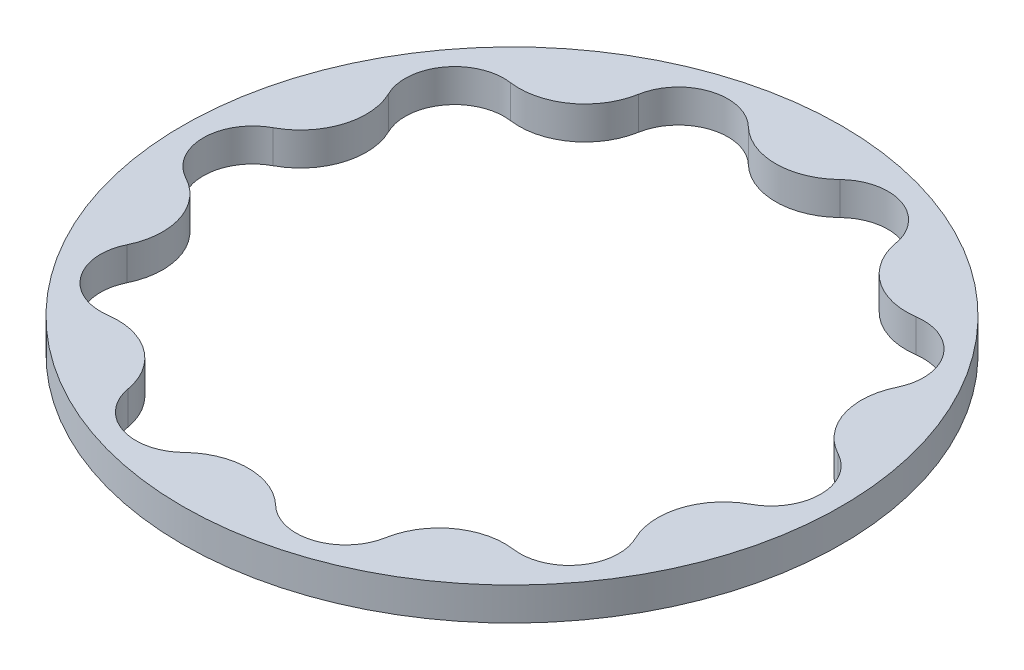
ISO-10303-21;
HEADER;
FILE_DESCRIPTION(('STEP AP214'),'2;1');
FILE_NAME('part.step','',(''),(''),'','','');
FILE_SCHEMA(('AUTOMOTIVE_DESIGN { 1 0 10303 214 1 1 1 1 }'));
ENDSEC;
DATA;
#1=APPLICATION_CONTEXT('core data for automotive mechanical design processes');
#2=APPLICATION_PROTOCOL_DEFINITION('international standard','automotive_design',2000,#1);
#3=PRODUCT_CONTEXT('',#1,'mechanical');
#4=PRODUCT('Part','Part','',(#3));
#5=PRODUCT_RELATED_PRODUCT_CATEGORY('part','',(#4));
#6=PRODUCT_DEFINITION_FORMATION('','',#4);
#7=PRODUCT_DEFINITION_CONTEXT('part definition',#1,'design');
#8=PRODUCT_DEFINITION('design','',#6,#7);
#9=PRODUCT_DEFINITION_SHAPE('','',#8);
#10=(LENGTH_UNIT() NAMED_UNIT(*) SI_UNIT(.MILLI.,.METRE.));
#11=(NAMED_UNIT(*) PLANE_ANGLE_UNIT() SI_UNIT($,.RADIAN.));
#12=(NAMED_UNIT(*) SI_UNIT($,.STERADIAN.) SOLID_ANGLE_UNIT());
#13=UNCERTAINTY_MEASURE_WITH_UNIT(LENGTH_MEASURE(1.E-05),#10,'distance_accuracy_value','');
#14=(GEOMETRIC_REPRESENTATION_CONTEXT(3) GLOBAL_UNCERTAINTY_ASSIGNED_CONTEXT((#13)) GLOBAL_UNIT_ASSIGNED_CONTEXT((#10,
#11,#12)) REPRESENTATION_CONTEXT('',''));
#15=CARTESIAN_POINT('',(0.,0.,0.));
#16=DIRECTION('',(0.,0.,1.));
#17=DIRECTION('',(1.,0.,0.));
#18=AXIS2_PLACEMENT_3D('',#15,#16,#17);
#19=CARTESIAN_POINT('',(0.,10.,0.));
#20=DIRECTION('',(0.,1.,0.));
#21=DIRECTION('',(0.,0.,1.));
#22=AXIS2_PLACEMENT_3D('',#19,#20,#21);
#23=PLANE('',#22);
#24=CARTESIAN_POINT('',(0.,10.,0.));
#25=DIRECTION('',(0.,1.,0.));
#26=DIRECTION('',(0.,0.,1.));
#27=AXIS2_PLACEMENT_3D('',#24,#25,#26);
#28=CIRCLE('',#27,100.);
#29=CARTESIAN_POINT('',(0.,10.,100.));
#30=VERTEX_POINT('',#29);
#31=EDGE_CURVE('E11',#30,#30,#28,.T.);
#32=ORIENTED_EDGE('',*,*,#31,.T.);
#33=EDGE_LOOP('',(#32));
#34=FACE_BOUND('',#33,.T.);
#35=CARTESIAN_POINT('',(0.,10.,-100.));
#36=DIRECTION('',(0.,-1.,0.));
#37=DIRECTION('',(0.,0.,1.));
#38=AXIS2_PLACEMENT_3D('',#35,#36,#37);
#39=CIRCLE('',#38,20.);
#40=CARTESIAN_POINT('',(13.8918836144796,10.,-85.6119643577814));
#41=VERTEX_POINT('',#40);
#42=CARTESIAN_POINT('',(-13.8918836144796,10.,-85.6119643577814));
#43=VERTEX_POINT('',#42);
#44=EDGE_CURVE('E179',#41,#43,#39,.T.);
#45=ORIENTED_EDGE('',*,*,#44,.F.);
#46=CARTESIAN_POINT('',(24.3107963253393,10.,-74.8209376261174));
#47=DIRECTION('',(0.,1.,0.));
#48=DIRECTION('',(0.,0.,-1.));
#49=AXIS2_PLACEMENT_3D('',#46,#47,#48);
#50=CIRCLE('',#49,15.);
#51=CARTESIAN_POINT('',(39.0826801412999,10.,-77.426978402422));
#52=VERTEX_POINT('',#51);
#53=EDGE_CURVE('E171',#52,#41,#50,.T.);
#54=ORIENTED_EDGE('',*,*,#53,.F.);
#55=CARTESIAN_POINT('',(58.7785252292473,10.,-80.9016994374948));
#56=DIRECTION('',(0.,-1.,0.));
#57=DIRECTION('',(0.,0.,1.));
#58=AXIS2_PLACEMENT_3D('',#55,#56,#57);
#59=CIRCLE('',#58,20.);
#60=CARTESIAN_POINT('',(61.5602199972856,10.,-61.0960897721129));
#61=VERTEX_POINT('',#60);
#62=EDGE_CURVE('E227',#61,#52,#59,.T.);
#63=ORIENTED_EDGE('',*,*,#62,.F.);
#64=CARTESIAN_POINT('',(63.6464910733144,10.,-46.2418825230764));
#65=DIRECTION('',(0.,1.,0.));
#66=DIRECTION('',(0.,0.,-1.));
#67=AXIS2_PLACEMENT_3D('',#64,#65,#66);
#68=CIRCLE('',#67,15.);
#69=CARTESIAN_POINT('',(77.1289884545434,10.,-39.6675183435414));
#70=VERTEX_POINT('',#69);
#71=EDGE_CURVE('E225',#70,#61,#68,.T.);
#72=ORIENTED_EDGE('',*,*,#71,.F.);
#73=CARTESIAN_POINT('',(95.1056516295154,10.,-30.9016994374948));
#74=DIRECTION('',(0.,-1.,0.));
#75=DIRECTION('',(0.,0.,1.));
#76=AXIS2_PLACEMENT_3D('',#73,#74,#75);
#77=CIRCLE('',#76,20.);
#78=CARTESIAN_POINT('',(85.7146446960495,10.,-13.243585473212));
#79=VERTEX_POINT('',#78);
#80=EDGE_CURVE('E223',#79,#70,#77,.T.);
#81=ORIENTED_EDGE('',*,*,#80,.F.);
#82=CARTESIAN_POINT('',(78.6713894959501,10.,0.));
#83=DIRECTION('',(0.,1.,0.));
#84=DIRECTION('',(0.,0.,-1.));
#85=AXIS2_PLACEMENT_3D('',#82,#83,#84);
#86=CIRCLE('',#85,15.);
#87=CARTESIAN_POINT('',(85.7146446960495,10.,13.243585473212));
#88=VERTEX_POINT('',#87);
#89=EDGE_CURVE('E221',#88,#79,#86,.T.);
#90=ORIENTED_EDGE('',*,*,#89,.F.);
#91=CARTESIAN_POINT('',(95.1056516295154,10.,30.9016994374947));
#92=DIRECTION('',(0.,-1.,0.));
#93=DIRECTION('',(0.,0.,1.));
#94=AXIS2_PLACEMENT_3D('',#91,#92,#93);
#95=CIRCLE('',#94,20.);
#96=CARTESIAN_POINT('',(77.1289884545434,10.,39.6675183435415));
#97=VERTEX_POINT('',#96);
#98=EDGE_CURVE('E219',#97,#88,#95,.T.);
#99=ORIENTED_EDGE('',*,*,#98,.F.);
#100=CARTESIAN_POINT('',(63.6464910733144,10.,46.2418825230765));
#101=DIRECTION('',(0.,1.,0.));
#102=DIRECTION('',(0.,0.,-1.));
#103=AXIS2_PLACEMENT_3D('',#100,#101,#102);
#104=CIRCLE('',#103,15.);
#105=CARTESIAN_POINT('',(61.5602199972856,10.,61.0960897721129));
#106=VERTEX_POINT('',#105);
#107=EDGE_CURVE('E217',#106,#97,#104,.T.);
#108=ORIENTED_EDGE('',*,*,#107,.F.);
#109=CARTESIAN_POINT('',(58.7785252292473,10.,80.9016994374947));
#110=DIRECTION('',(0.,-1.,0.));
#111=DIRECTION('',(0.,0.,1.));
#112=AXIS2_PLACEMENT_3D('',#109,#110,#111);
#113=CIRCLE('',#112,20.);
#114=CARTESIAN_POINT('',(39.0826801412999,10.,77.4269784024221));
#115=VERTEX_POINT('',#114);
#116=EDGE_CURVE('E215',#115,#106,#113,.T.);
#117=ORIENTED_EDGE('',*,*,#116,.F.);
#118=CARTESIAN_POINT('',(24.3107963253393,10.,74.8209376261175));
#119=DIRECTION('',(0.,1.,0.));
#120=DIRECTION('',(0.,0.,-1.));
#121=AXIS2_PLACEMENT_3D('',#118,#119,#120);
#122=CIRCLE('',#121,15.);
#123=CARTESIAN_POINT('',(13.8918836144796,10.,85.6119643577815));
#124=VERTEX_POINT('',#123);
#125=EDGE_CURVE('E213',#124,#115,#122,.T.);
#126=ORIENTED_EDGE('',*,*,#125,.F.);
#127=CARTESIAN_POINT('',(0.,10.,100.));
#128=DIRECTION('',(0.,-1.,0.));
#129=DIRECTION('',(0.,0.,1.));
#130=AXIS2_PLACEMENT_3D('',#127,#128,#129);
#131=CIRCLE('',#130,20.);
#132=CARTESIAN_POINT('',(-13.8918836144796,10.,85.6119643577815));
#133=VERTEX_POINT('',#132);
#134=EDGE_CURVE('E211',#133,#124,#131,.T.);
#135=ORIENTED_EDGE('',*,*,#134,.F.);
#136=CARTESIAN_POINT('',(-24.3107963253393,10.,74.8209376261175));
#137=DIRECTION('',(0.,1.,0.));
#138=DIRECTION('',(0.,0.,-1.));
#139=AXIS2_PLACEMENT_3D('',#136,#137,#138);
#140=CIRCLE('',#139,15.);
#141=CARTESIAN_POINT('',(-39.0826801412999,10.,77.4269784024221));
#142=VERTEX_POINT('',#141);
#143=EDGE_CURVE('E209',#142,#133,#140,.T.);
#144=ORIENTED_EDGE('',*,*,#143,.F.);
#145=CARTESIAN_POINT('',(-58.7785252292473,10.,80.9016994374947));
#146=DIRECTION('',(0.,-1.,0.));
#147=DIRECTION('',(0.,0.,1.));
#148=AXIS2_PLACEMENT_3D('',#145,#146,#147);
#149=CIRCLE('',#148,20.);
#150=CARTESIAN_POINT('',(-61.5602199972857,10.,61.0960897721129));
#151=VERTEX_POINT('',#150);
#152=EDGE_CURVE('E207',#151,#142,#149,.T.);
#153=ORIENTED_EDGE('',*,*,#152,.F.);
#154=CARTESIAN_POINT('',(-63.6464910733144,10.,46.2418825230765));
#155=DIRECTION('',(0.,1.,0.));
#156=DIRECTION('',(0.,0.,-1.));
#157=AXIS2_PLACEMENT_3D('',#154,#155,#156);
#158=CIRCLE('',#157,15.);
#159=CARTESIAN_POINT('',(-77.1289884545434,10.,39.6675183435415));
#160=VERTEX_POINT('',#159);
#161=EDGE_CURVE('E205',#160,#151,#158,.T.);
#162=ORIENTED_EDGE('',*,*,#161,.F.);
#163=CARTESIAN_POINT('',(-95.1056516295154,10.,30.9016994374947));
#164=DIRECTION('',(0.,-1.,0.));
#165=DIRECTION('',(0.,0.,1.));
#166=AXIS2_PLACEMENT_3D('',#163,#164,#165);
#167=CIRCLE('',#166,20.);
#168=CARTESIAN_POINT('',(-85.7146446960495,10.,13.2435854732121));
#169=VERTEX_POINT('',#168);
#170=EDGE_CURVE('E203',#169,#160,#167,.T.);
#171=ORIENTED_EDGE('',*,*,#170,.F.);
#172=CARTESIAN_POINT('',(-78.6713894959501,10.,0.));
#173=DIRECTION('',(0.,1.,0.));
#174=DIRECTION('',(0.,0.,-1.));
#175=AXIS2_PLACEMENT_3D('',#172,#173,#174);
#176=CIRCLE('',#175,15.);
#177=CARTESIAN_POINT('',(-85.7146446960496,10.,-13.243585473212));
#178=VERTEX_POINT('',#177);
#179=EDGE_CURVE('E201',#178,#169,#176,.T.);
#180=ORIENTED_EDGE('',*,*,#179,.F.);
#181=CARTESIAN_POINT('',(-95.1056516295154,10.,-30.9016994374947));
#182=DIRECTION('',(0.,-1.,0.));
#183=DIRECTION('',(0.,0.,1.));
#184=AXIS2_PLACEMENT_3D('',#181,#182,#183);
#185=CIRCLE('',#184,20.);
#186=CARTESIAN_POINT('',(-77.1289884545434,10.,-39.6675183435414));
#187=VERTEX_POINT('',#186);
#188=EDGE_CURVE('E199',#187,#178,#185,.T.);
#189=ORIENTED_EDGE('',*,*,#188,.F.);
#190=CARTESIAN_POINT('',(-63.6464910733144,10.,-46.2418825230764));
#191=DIRECTION('',(0.,1.,0.));
#192=DIRECTION('',(0.,0.,-1.));
#193=AXIS2_PLACEMENT_3D('',#190,#191,#192);
#194=CIRCLE('',#193,15.);
#195=CARTESIAN_POINT('',(-61.5602199972857,10.,-61.0960897721129));
#196=VERTEX_POINT('',#195);
#197=EDGE_CURVE('E197',#196,#187,#194,.T.);
#198=ORIENTED_EDGE('',*,*,#197,.F.);
#199=CARTESIAN_POINT('',(-58.7785252292473,10.,-80.9016994374947));
#200=DIRECTION('',(0.,-1.,0.));
#201=DIRECTION('',(0.,0.,1.));
#202=AXIS2_PLACEMENT_3D('',#199,#200,#201);
#203=CIRCLE('',#202,20.);
#204=CARTESIAN_POINT('',(-39.0826801412999,10.,-77.426978402422));
#205=VERTEX_POINT('',#204);
#206=EDGE_CURVE('E193',#205,#196,#203,.T.);
#207=ORIENTED_EDGE('',*,*,#206,.F.);
#208=CARTESIAN_POINT('',(-24.3107963253393,10.,-74.8209376261174));
#209=DIRECTION('',(0.,1.,0.));
#210=DIRECTION('',(0.,0.,-1.));
#211=AXIS2_PLACEMENT_3D('',#208,#209,#210);
#212=CIRCLE('',#211,15.);
#213=EDGE_CURVE('E191',#43,#205,#212,.T.);
#214=ORIENTED_EDGE('',*,*,#213,.F.);
#215=EDGE_LOOP('',(#45,#54,#63,#72,#81,#90,#99,#108,#117,#126,#135,#144,#153,#162,#171,#180,
#189,#198,#207,#214));
#216=FACE_BOUND('',#215,.T.);
#217=ADVANCED_FACE('F34',(#34,#216),#23,.T.);
#218=CARTESIAN_POINT('',(0.,0.,0.));
#219=DIRECTION('',(0.,1.,0.));
#220=DIRECTION('',(0.,0.,1.));
#221=AXIS2_PLACEMENT_3D('',#218,#219,#220);
#222=PLANE('',#221);
#223=CARTESIAN_POINT('',(0.,0.,0.));
#224=DIRECTION('',(0.,1.,0.));
#225=DIRECTION('',(0.,0.,1.));
#226=AXIS2_PLACEMENT_3D('',#223,#224,#225);
#227=CIRCLE('',#226,100.);
#228=CARTESIAN_POINT('',(0.,0.,100.));
#229=VERTEX_POINT('',#228);
#230=EDGE_CURVE('E38',#229,#229,#227,.T.);
#231=ORIENTED_EDGE('',*,*,#230,.F.);
#232=EDGE_LOOP('',(#231));
#233=FACE_BOUND('',#232,.T.);
#234=CARTESIAN_POINT('',(24.3107963253393,0.,-74.8209376261174));
#235=DIRECTION('',(0.,1.,0.));
#236=DIRECTION('',(0.,0.,-1.));
#237=AXIS2_PLACEMENT_3D('',#234,#235,#236);
#238=CIRCLE('',#237,15.);
#239=CARTESIAN_POINT('',(39.0826801412999,0.,-77.426978402422));
#240=VERTEX_POINT('',#239);
#241=CARTESIAN_POINT('',(13.8918836144796,0.,-85.6119643577814));
#242=VERTEX_POINT('',#241);
#243=EDGE_CURVE('E57',#240,#242,#238,.T.);
#244=ORIENTED_EDGE('',*,*,#243,.T.);
#245=CARTESIAN_POINT('',(0.,0.,-100.));
#246=DIRECTION('',(0.,-1.,0.));
#247=DIRECTION('',(0.,0.,1.));
#248=AXIS2_PLACEMENT_3D('',#245,#246,#247);
#249=CIRCLE('',#248,20.);
#250=CARTESIAN_POINT('',(-13.8918836144796,0.,-85.6119643577814));
#251=VERTEX_POINT('',#250);
#252=EDGE_CURVE('E186',#242,#251,#249,.T.);
#253=ORIENTED_EDGE('',*,*,#252,.T.);
#254=CARTESIAN_POINT('',(-24.3107963253393,0.,-74.8209376261174));
#255=DIRECTION('',(0.,1.,0.));
#256=DIRECTION('',(0.,0.,-1.));
#257=AXIS2_PLACEMENT_3D('',#254,#255,#256);
#258=CIRCLE('',#257,15.);
#259=CARTESIAN_POINT('',(-39.0826801412999,0.,-77.426978402422));
#260=VERTEX_POINT('',#259);
#261=EDGE_CURVE('E231',#251,#260,#258,.T.);
#262=ORIENTED_EDGE('',*,*,#261,.T.);
#263=CARTESIAN_POINT('',(-58.7785252292473,0.,-80.9016994374947));
#264=DIRECTION('',(0.,-1.,0.));
#265=DIRECTION('',(0.,0.,1.));
#266=AXIS2_PLACEMENT_3D('',#263,#264,#265);
#267=CIRCLE('',#266,20.);
#268=CARTESIAN_POINT('',(-61.5602199972857,0.,-61.0960897721129));
#269=VERTEX_POINT('',#268);
#270=EDGE_CURVE('E234',#260,#269,#267,.T.);
#271=ORIENTED_EDGE('',*,*,#270,.T.);
#272=CARTESIAN_POINT('',(-63.6464910733144,0.,-46.2418825230764));
#273=DIRECTION('',(0.,1.,0.));
#274=DIRECTION('',(0.,0.,-1.));
#275=AXIS2_PLACEMENT_3D('',#272,#273,#274);
#276=CIRCLE('',#275,15.);
#277=CARTESIAN_POINT('',(-77.1289884545434,0.,-39.6675183435414));
#278=VERTEX_POINT('',#277);
#279=EDGE_CURVE('E237',#269,#278,#276,.T.);
#280=ORIENTED_EDGE('',*,*,#279,.T.);
#281=CARTESIAN_POINT('',(-95.1056516295154,0.,-30.9016994374947));
#282=DIRECTION('',(0.,-1.,0.));
#283=DIRECTION('',(0.,0.,1.));
#284=AXIS2_PLACEMENT_3D('',#281,#282,#283);
#285=CIRCLE('',#284,20.);
#286=CARTESIAN_POINT('',(-85.7146446960496,0.,-13.243585473212));
#287=VERTEX_POINT('',#286);
#288=EDGE_CURVE('E240',#278,#287,#285,.T.);
#289=ORIENTED_EDGE('',*,*,#288,.T.);
#290=CARTESIAN_POINT('',(-78.6713894959501,0.,0.));
#291=DIRECTION('',(0.,1.,0.));
#292=DIRECTION('',(0.,0.,-1.));
#293=AXIS2_PLACEMENT_3D('',#290,#291,#292);
#294=CIRCLE('',#293,15.);
#295=CARTESIAN_POINT('',(-85.7146446960495,0.,13.2435854732121));
#296=VERTEX_POINT('',#295);
#297=EDGE_CURVE('E243',#287,#296,#294,.T.);
#298=ORIENTED_EDGE('',*,*,#297,.T.);
#299=CARTESIAN_POINT('',(-95.1056516295154,0.,30.9016994374947));
#300=DIRECTION('',(0.,-1.,0.));
#301=DIRECTION('',(0.,0.,1.));
#302=AXIS2_PLACEMENT_3D('',#299,#300,#301);
#303=CIRCLE('',#302,20.);
#304=CARTESIAN_POINT('',(-77.1289884545434,0.,39.6675183435415));
#305=VERTEX_POINT('',#304);
#306=EDGE_CURVE('E246',#296,#305,#303,.T.);
#307=ORIENTED_EDGE('',*,*,#306,.T.);
#308=CARTESIAN_POINT('',(-63.6464910733144,0.,46.2418825230765));
#309=DIRECTION('',(0.,1.,0.));
#310=DIRECTION('',(0.,0.,-1.));
#311=AXIS2_PLACEMENT_3D('',#308,#309,#310);
#312=CIRCLE('',#311,15.);
#313=CARTESIAN_POINT('',(-61.5602199972857,0.,61.0960897721129));
#314=VERTEX_POINT('',#313);
#315=EDGE_CURVE('E249',#305,#314,#312,.T.);
#316=ORIENTED_EDGE('',*,*,#315,.T.);
#317=CARTESIAN_POINT('',(-58.7785252292473,0.,80.9016994374947));
#318=DIRECTION('',(0.,-1.,0.));
#319=DIRECTION('',(0.,0.,1.));
#320=AXIS2_PLACEMENT_3D('',#317,#318,#319);
#321=CIRCLE('',#320,20.);
#322=CARTESIAN_POINT('',(-39.0826801412999,0.,77.4269784024221));
#323=VERTEX_POINT('',#322);
#324=EDGE_CURVE('E252',#314,#323,#321,.T.);
#325=ORIENTED_EDGE('',*,*,#324,.T.);
#326=CARTESIAN_POINT('',(-24.3107963253393,0.,74.8209376261175));
#327=DIRECTION('',(0.,1.,0.));
#328=DIRECTION('',(0.,0.,-1.));
#329=AXIS2_PLACEMENT_3D('',#326,#327,#328);
#330=CIRCLE('',#329,15.);
#331=CARTESIAN_POINT('',(-13.8918836144796,0.,85.6119643577815));
#332=VERTEX_POINT('',#331);
#333=EDGE_CURVE('E255',#323,#332,#330,.T.);
#334=ORIENTED_EDGE('',*,*,#333,.T.);
#335=CARTESIAN_POINT('',(0.,0.,100.));
#336=DIRECTION('',(0.,-1.,0.));
#337=DIRECTION('',(0.,0.,1.));
#338=AXIS2_PLACEMENT_3D('',#335,#336,#337);
#339=CIRCLE('',#338,20.);
#340=CARTESIAN_POINT('',(13.8918836144796,0.,85.6119643577815));
#341=VERTEX_POINT('',#340);
#342=EDGE_CURVE('E258',#332,#341,#339,.T.);
#343=ORIENTED_EDGE('',*,*,#342,.T.);
#344=CARTESIAN_POINT('',(24.3107963253393,0.,74.8209376261175));
#345=DIRECTION('',(0.,1.,0.));
#346=DIRECTION('',(0.,0.,-1.));
#347=AXIS2_PLACEMENT_3D('',#344,#345,#346);
#348=CIRCLE('',#347,15.);
#349=CARTESIAN_POINT('',(39.0826801412999,0.,77.4269784024221));
#350=VERTEX_POINT('',#349);
#351=EDGE_CURVE('E261',#341,#350,#348,.T.);
#352=ORIENTED_EDGE('',*,*,#351,.T.);
#353=CARTESIAN_POINT('',(58.7785252292473,0.,80.9016994374947));
#354=DIRECTION('',(0.,-1.,0.));
#355=DIRECTION('',(0.,0.,1.));
#356=AXIS2_PLACEMENT_3D('',#353,#354,#355);
#357=CIRCLE('',#356,20.);
#358=CARTESIAN_POINT('',(61.5602199972856,0.,61.0960897721129));
#359=VERTEX_POINT('',#358);
#360=EDGE_CURVE('E264',#350,#359,#357,.T.);
#361=ORIENTED_EDGE('',*,*,#360,.T.);
#362=CARTESIAN_POINT('',(63.6464910733144,0.,46.2418825230765));
#363=DIRECTION('',(0.,1.,0.));
#364=DIRECTION('',(0.,0.,-1.));
#365=AXIS2_PLACEMENT_3D('',#362,#363,#364);
#366=CIRCLE('',#365,15.);
#367=CARTESIAN_POINT('',(77.1289884545434,0.,39.6675183435415));
#368=VERTEX_POINT('',#367);
#369=EDGE_CURVE('E267',#359,#368,#366,.T.);
#370=ORIENTED_EDGE('',*,*,#369,.T.);
#371=CARTESIAN_POINT('',(95.1056516295154,0.,30.9016994374947));
#372=DIRECTION('',(0.,-1.,0.));
#373=DIRECTION('',(0.,0.,1.));
#374=AXIS2_PLACEMENT_3D('',#371,#372,#373);
#375=CIRCLE('',#374,20.);
#376=CARTESIAN_POINT('',(85.7146446960495,0.,13.243585473212));
#377=VERTEX_POINT('',#376);
#378=EDGE_CURVE('E270',#368,#377,#375,.T.);
#379=ORIENTED_EDGE('',*,*,#378,.T.);
#380=CARTESIAN_POINT('',(78.6713894959501,0.,0.));
#381=DIRECTION('',(0.,1.,0.));
#382=DIRECTION('',(0.,0.,-1.));
#383=AXIS2_PLACEMENT_3D('',#380,#381,#382);
#384=CIRCLE('',#383,15.);
#385=CARTESIAN_POINT('',(85.7146446960495,0.,-13.243585473212));
#386=VERTEX_POINT('',#385);
#387=EDGE_CURVE('E273',#377,#386,#384,.T.);
#388=ORIENTED_EDGE('',*,*,#387,.T.);
#389=CARTESIAN_POINT('',(95.1056516295154,0.,-30.9016994374948));
#390=DIRECTION('',(0.,-1.,0.));
#391=DIRECTION('',(0.,0.,1.));
#392=AXIS2_PLACEMENT_3D('',#389,#390,#391);
#393=CIRCLE('',#392,20.);
#394=CARTESIAN_POINT('',(77.1289884545434,0.,-39.6675183435414));
#395=VERTEX_POINT('',#394);
#396=EDGE_CURVE('E276',#386,#395,#393,.T.);
#397=ORIENTED_EDGE('',*,*,#396,.T.);
#398=CARTESIAN_POINT('',(63.6464910733144,0.,-46.2418825230764));
#399=DIRECTION('',(0.,1.,0.));
#400=DIRECTION('',(0.,0.,-1.));
#401=AXIS2_PLACEMENT_3D('',#398,#399,#400);
#402=CIRCLE('',#401,15.);
#403=CARTESIAN_POINT('',(61.5602199972856,0.,-61.0960897721129));
#404=VERTEX_POINT('',#403);
#405=EDGE_CURVE('E279',#395,#404,#402,.T.);
#406=ORIENTED_EDGE('',*,*,#405,.T.);
#407=CARTESIAN_POINT('',(58.7785252292473,0.,-80.9016994374948));
#408=DIRECTION('',(0.,-1.,0.));
#409=DIRECTION('',(0.,0.,1.));
#410=AXIS2_PLACEMENT_3D('',#407,#408,#409);
#411=CIRCLE('',#410,20.);
#412=EDGE_CURVE('E180',#404,#240,#411,.T.);
#413=ORIENTED_EDGE('',*,*,#412,.T.);
#414=EDGE_LOOP('',(#244,#253,#262,#271,#280,#289,#298,#307,#316,#325,#334,#343,#352,#361,#370,
#379,#388,#397,#406,#413));
#415=FACE_BOUND('',#414,.T.);
#416=ADVANCED_FACE('F324',(#233,#415),#222,.F.);
#417=CARTESIAN_POINT('',(0.,10.,0.));
#418=DIRECTION('',(0.,-1.,0.));
#419=DIRECTION('',(0.,0.,-1.));
#420=AXIS2_PLACEMENT_3D('',#417,#418,#419);
#421=CYLINDRICAL_SURFACE('',#420,100.);
#422=ORIENTED_EDGE('',*,*,#31,.F.);
#423=EDGE_LOOP('',(#422));
#424=FACE_BOUND('',#423,.T.);
#425=ORIENTED_EDGE('',*,*,#230,.T.);
#426=EDGE_LOOP('',(#425));
#427=FACE_BOUND('',#426,.T.);
#428=ADVANCED_FACE('F36',(#424,#427),#421,.T.);
#429=CARTESIAN_POINT('',(24.3107963253393,10.,-74.8209376261174));
#430=DIRECTION('',(0.,-1.,0.));
#431=DIRECTION('',(0.,0.,-1.));
#432=AXIS2_PLACEMENT_3D('',#429,#430,#431);
#433=CYLINDRICAL_SURFACE('',#432,15.);
#434=ORIENTED_EDGE('',*,*,#243,.F.);
#435=DIRECTION('',(0.,-1.,0.));
#436=VECTOR('',#435,1.);
#437=CARTESIAN_POINT('',(39.0826801412999,10.,-77.426978402422));
#438=LINE('',#437,#436);
#439=EDGE_CURVE('E175',#52,#240,#438,.T.);
#440=ORIENTED_EDGE('',*,*,#439,.F.);
#441=ORIENTED_EDGE('',*,*,#53,.T.);
#442=DIRECTION('',(0.,-1.,0.));
#443=VECTOR('',#442,1.);
#444=CARTESIAN_POINT('',(13.8918836144796,10.,-85.6119643577814));
#445=LINE('',#444,#443);
#446=EDGE_CURVE('E174',#41,#242,#445,.T.);
#447=ORIENTED_EDGE('',*,*,#446,.T.);
#448=EDGE_LOOP('',(#434,#440,#441,#447));
#449=FACE_BOUND('',#448,.T.);
#450=ADVANCED_FACE('F173',(#449),#433,.F.);
#451=CARTESIAN_POINT('',(0.,10.,-100.));
#452=DIRECTION('',(0.,-1.,0.));
#453=DIRECTION('',(0.,0.,-1.));
#454=AXIS2_PLACEMENT_3D('',#451,#452,#453);
#455=CYLINDRICAL_SURFACE('',#454,20.);
#456=ORIENTED_EDGE('',*,*,#252,.F.);
#457=ORIENTED_EDGE('',*,*,#446,.F.);
#458=ORIENTED_EDGE('',*,*,#44,.T.);
#459=DIRECTION('',(0.,-1.,0.));
#460=VECTOR('',#459,1.);
#461=CARTESIAN_POINT('',(-13.8918836144796,10.,-85.6119643577814));
#462=LINE('',#461,#460);
#463=EDGE_CURVE('E187',#43,#251,#462,.T.);
#464=ORIENTED_EDGE('',*,*,#463,.T.);
#465=EDGE_LOOP('',(#456,#457,#458,#464));
#466=FACE_BOUND('',#465,.T.);
#467=ADVANCED_FACE('F183',(#466),#455,.T.);
#468=CARTESIAN_POINT('',(-24.3107963253393,10.,-74.8209376261174));
#469=DIRECTION('',(0.,-1.,0.));
#470=DIRECTION('',(0.,0.,-1.));
#471=AXIS2_PLACEMENT_3D('',#468,#469,#470);
#472=CYLINDRICAL_SURFACE('',#471,15.);
#473=ORIENTED_EDGE('',*,*,#261,.F.);
#474=ORIENTED_EDGE('',*,*,#463,.F.);
#475=ORIENTED_EDGE('',*,*,#213,.T.);
#476=DIRECTION('',(0.,-1.,0.));
#477=VECTOR('',#476,1.);
#478=CARTESIAN_POINT('',(-39.0826801412999,10.,-77.426978402422));
#479=LINE('',#478,#477);
#480=EDGE_CURVE('E316',#205,#260,#479,.T.);
#481=ORIENTED_EDGE('',*,*,#480,.T.);
#482=EDGE_LOOP('',(#473,#474,#475,#481));
#483=FACE_BOUND('',#482,.T.);
#484=ADVANCED_FACE('F320',(#483),#472,.F.);
#485=CARTESIAN_POINT('',(-58.7785252292473,10.,-80.9016994374947));
#486=DIRECTION('',(0.,-1.,0.));
#487=DIRECTION('',(0.,0.,-1.));
#488=AXIS2_PLACEMENT_3D('',#485,#486,#487);
#489=CYLINDRICAL_SURFACE('',#488,20.);
#490=ORIENTED_EDGE('',*,*,#270,.F.);
#491=ORIENTED_EDGE('',*,*,#480,.F.);
#492=ORIENTED_EDGE('',*,*,#206,.T.);
#493=DIRECTION('',(0.,-1.,0.));
#494=VECTOR('',#493,1.);
#495=CARTESIAN_POINT('',(-61.5602199972857,10.,-61.0960897721129));
#496=LINE('',#495,#494);
#497=EDGE_CURVE('E314',#196,#269,#496,.T.);
#498=ORIENTED_EDGE('',*,*,#497,.T.);
#499=EDGE_LOOP('',(#490,#491,#492,#498));
#500=FACE_BOUND('',#499,.T.);
#501=ADVANCED_FACE('F402',(#500),#489,.T.);
#502=CARTESIAN_POINT('',(-63.6464910733144,10.,-46.2418825230764));
#503=DIRECTION('',(0.,-1.,0.));
#504=DIRECTION('',(0.,0.,-1.));
#505=AXIS2_PLACEMENT_3D('',#502,#503,#504);
#506=CYLINDRICAL_SURFACE('',#505,15.);
#507=ORIENTED_EDGE('',*,*,#279,.F.);
#508=ORIENTED_EDGE('',*,*,#497,.F.);
#509=ORIENTED_EDGE('',*,*,#197,.T.);
#510=DIRECTION('',(0.,-1.,0.));
#511=VECTOR('',#510,1.);
#512=CARTESIAN_POINT('',(-77.1289884545434,10.,-39.6675183435414));
#513=LINE('',#512,#511);
#514=EDGE_CURVE('E312',#187,#278,#513,.T.);
#515=ORIENTED_EDGE('',*,*,#514,.T.);
#516=EDGE_LOOP('',(#507,#508,#509,#515));
#517=FACE_BOUND('',#516,.T.);
#518=ADVANCED_FACE('F399',(#517),#506,.F.);
#519=CARTESIAN_POINT('',(-95.1056516295154,10.,-30.9016994374947));
#520=DIRECTION('',(0.,-1.,0.));
#521=DIRECTION('',(0.,0.,-1.));
#522=AXIS2_PLACEMENT_3D('',#519,#520,#521);
#523=CYLINDRICAL_SURFACE('',#522,20.);
#524=ORIENTED_EDGE('',*,*,#288,.F.);
#525=ORIENTED_EDGE('',*,*,#514,.F.);
#526=ORIENTED_EDGE('',*,*,#188,.T.);
#527=DIRECTION('',(0.,-1.,0.));
#528=VECTOR('',#527,1.);
#529=CARTESIAN_POINT('',(-85.7146446960496,10.,-13.243585473212));
#530=LINE('',#529,#528);
#531=EDGE_CURVE('E310',#178,#287,#530,.T.);
#532=ORIENTED_EDGE('',*,*,#531,.T.);
#533=EDGE_LOOP('',(#524,#525,#526,#532));
#534=FACE_BOUND('',#533,.T.);
#535=ADVANCED_FACE('F395',(#534),#523,.T.);
#536=CARTESIAN_POINT('',(-78.6713894959501,10.,0.));
#537=DIRECTION('',(0.,-1.,0.));
#538=DIRECTION('',(0.,0.,-1.));
#539=AXIS2_PLACEMENT_3D('',#536,#537,#538);
#540=CYLINDRICAL_SURFACE('',#539,15.);
#541=ORIENTED_EDGE('',*,*,#297,.F.);
#542=ORIENTED_EDGE('',*,*,#531,.F.);
#543=ORIENTED_EDGE('',*,*,#179,.T.);
#544=DIRECTION('',(0.,-1.,0.));
#545=VECTOR('',#544,1.);
#546=CARTESIAN_POINT('',(-85.7146446960495,10.,13.2435854732121));
#547=LINE('',#546,#545);
#548=EDGE_CURVE('E308',#169,#296,#547,.T.);
#549=ORIENTED_EDGE('',*,*,#548,.T.);
#550=EDGE_LOOP('',(#541,#542,#543,#549));
#551=FACE_BOUND('',#550,.T.);
#552=ADVANCED_FACE('F392',(#551),#540,.F.);
#553=CARTESIAN_POINT('',(-95.1056516295154,10.,30.9016994374947));
#554=DIRECTION('',(0.,-1.,0.));
#555=DIRECTION('',(0.,0.,-1.));
#556=AXIS2_PLACEMENT_3D('',#553,#554,#555);
#557=CYLINDRICAL_SURFACE('',#556,20.);
#558=ORIENTED_EDGE('',*,*,#306,.F.);
#559=ORIENTED_EDGE('',*,*,#548,.F.);
#560=ORIENTED_EDGE('',*,*,#170,.T.);
#561=DIRECTION('',(0.,-1.,0.));
#562=VECTOR('',#561,1.);
#563=CARTESIAN_POINT('',(-77.1289884545434,10.,39.6675183435415));
#564=LINE('',#563,#562);
#565=EDGE_CURVE('E306',#160,#305,#564,.T.);
#566=ORIENTED_EDGE('',*,*,#565,.T.);
#567=EDGE_LOOP('',(#558,#559,#560,#566));
#568=FACE_BOUND('',#567,.T.);
#569=ADVANCED_FACE('F384',(#568),#557,.T.);
#570=CARTESIAN_POINT('',(-63.6464910733144,10.,46.2418825230765));
#571=DIRECTION('',(0.,-1.,0.));
#572=DIRECTION('',(0.,0.,-1.));
#573=AXIS2_PLACEMENT_3D('',#570,#571,#572);
#574=CYLINDRICAL_SURFACE('',#573,15.);
#575=ORIENTED_EDGE('',*,*,#315,.F.);
#576=ORIENTED_EDGE('',*,*,#565,.F.);
#577=ORIENTED_EDGE('',*,*,#161,.T.);
#578=DIRECTION('',(0.,-1.,0.));
#579=VECTOR('',#578,1.);
#580=CARTESIAN_POINT('',(-61.5602199972857,10.,61.0960897721129));
#581=LINE('',#580,#579);
#582=EDGE_CURVE('E304',#151,#314,#581,.T.);
#583=ORIENTED_EDGE('',*,*,#582,.T.);
#584=EDGE_LOOP('',(#575,#576,#577,#583));
#585=FACE_BOUND('',#584,.T.);
#586=ADVANCED_FACE('F380',(#585),#574,.F.);
#587=CARTESIAN_POINT('',(-58.7785252292473,10.,80.9016994374947));
#588=DIRECTION('',(0.,-1.,0.));
#589=DIRECTION('',(0.,0.,-1.));
#590=AXIS2_PLACEMENT_3D('',#587,#588,#589);
#591=CYLINDRICAL_SURFACE('',#590,20.);
#592=ORIENTED_EDGE('',*,*,#324,.F.);
#593=ORIENTED_EDGE('',*,*,#582,.F.);
#594=ORIENTED_EDGE('',*,*,#152,.T.);
#595=DIRECTION('',(0.,-1.,0.));
#596=VECTOR('',#595,1.);
#597=CARTESIAN_POINT('',(-39.0826801412999,10.,77.4269784024221));
#598=LINE('',#597,#596);
#599=EDGE_CURVE('E302',#142,#323,#598,.T.);
#600=ORIENTED_EDGE('',*,*,#599,.T.);
#601=EDGE_LOOP('',(#592,#593,#594,#600));
#602=FACE_BOUND('',#601,.T.);
#603=ADVANCED_FACE('F377',(#602),#591,.T.);
#604=CARTESIAN_POINT('',(-24.3107963253393,10.,74.8209376261175));
#605=DIRECTION('',(0.,-1.,0.));
#606=DIRECTION('',(0.,0.,-1.));
#607=AXIS2_PLACEMENT_3D('',#604,#605,#606);
#608=CYLINDRICAL_SURFACE('',#607,15.);
#609=ORIENTED_EDGE('',*,*,#333,.F.);
#610=ORIENTED_EDGE('',*,*,#599,.F.);
#611=ORIENTED_EDGE('',*,*,#143,.T.);
#612=DIRECTION('',(0.,-1.,0.));
#613=VECTOR('',#612,1.);
#614=CARTESIAN_POINT('',(-13.8918836144796,10.,85.6119643577815));
#615=LINE('',#614,#613);
#616=EDGE_CURVE('E300',#133,#332,#615,.T.);
#617=ORIENTED_EDGE('',*,*,#616,.T.);
#618=EDGE_LOOP('',(#609,#610,#611,#617));
#619=FACE_BOUND('',#618,.T.);
#620=ADVANCED_FACE('F369',(#619),#608,.F.);
#621=CARTESIAN_POINT('',(0.,10.,100.));
#622=DIRECTION('',(0.,-1.,0.));
#623=DIRECTION('',(0.,0.,-1.));
#624=AXIS2_PLACEMENT_3D('',#621,#622,#623);
#625=CYLINDRICAL_SURFACE('',#624,20.);
#626=ORIENTED_EDGE('',*,*,#342,.F.);
#627=ORIENTED_EDGE('',*,*,#616,.F.);
#628=ORIENTED_EDGE('',*,*,#134,.T.);
#629=DIRECTION('',(0.,-1.,0.));
#630=VECTOR('',#629,1.);
#631=CARTESIAN_POINT('',(13.8918836144796,10.,85.6119643577815));
#632=LINE('',#631,#630);
#633=EDGE_CURVE('E298',#124,#341,#632,.T.);
#634=ORIENTED_EDGE('',*,*,#633,.T.);
#635=EDGE_LOOP('',(#626,#627,#628,#634));
#636=FACE_BOUND('',#635,.T.);
#637=ADVANCED_FACE('F365',(#636),#625,.T.);
#638=CARTESIAN_POINT('',(24.3107963253393,10.,74.8209376261175));
#639=DIRECTION('',(0.,-1.,0.));
#640=DIRECTION('',(0.,0.,-1.));
#641=AXIS2_PLACEMENT_3D('',#638,#639,#640);
#642=CYLINDRICAL_SURFACE('',#641,15.);
#643=ORIENTED_EDGE('',*,*,#351,.F.);
#644=ORIENTED_EDGE('',*,*,#633,.F.);
#645=ORIENTED_EDGE('',*,*,#125,.T.);
#646=DIRECTION('',(0.,-1.,0.));
#647=VECTOR('',#646,1.);
#648=CARTESIAN_POINT('',(39.0826801412999,10.,77.4269784024221));
#649=LINE('',#648,#647);
#650=EDGE_CURVE('E296',#115,#350,#649,.T.);
#651=ORIENTED_EDGE('',*,*,#650,.T.);
#652=EDGE_LOOP('',(#643,#644,#645,#651));
#653=FACE_BOUND('',#652,.T.);
#654=ADVANCED_FACE('F362',(#653),#642,.F.);
#655=CARTESIAN_POINT('',(58.7785252292473,10.,80.9016994374947));
#656=DIRECTION('',(0.,-1.,0.));
#657=DIRECTION('',(0.,0.,-1.));
#658=AXIS2_PLACEMENT_3D('',#655,#656,#657);
#659=CYLINDRICAL_SURFACE('',#658,20.);
#660=ORIENTED_EDGE('',*,*,#360,.F.);
#661=ORIENTED_EDGE('',*,*,#650,.F.);
#662=ORIENTED_EDGE('',*,*,#116,.T.);
#663=DIRECTION('',(0.,-1.,0.));
#664=VECTOR('',#663,1.);
#665=CARTESIAN_POINT('',(61.5602199972856,10.,61.0960897721129));
#666=LINE('',#665,#664);
#667=EDGE_CURVE('E294',#106,#359,#666,.T.);
#668=ORIENTED_EDGE('',*,*,#667,.T.);
#669=EDGE_LOOP('',(#660,#661,#662,#668));
#670=FACE_BOUND('',#669,.T.);
#671=ADVANCED_FACE('F354',(#670),#659,.T.);
#672=CARTESIAN_POINT('',(63.6464910733144,10.,46.2418825230765));
#673=DIRECTION('',(0.,-1.,0.));
#674=DIRECTION('',(0.,0.,-1.));
#675=AXIS2_PLACEMENT_3D('',#672,#673,#674);
#676=CYLINDRICAL_SURFACE('',#675,15.);
#677=ORIENTED_EDGE('',*,*,#369,.F.);
#678=ORIENTED_EDGE('',*,*,#667,.F.);
#679=ORIENTED_EDGE('',*,*,#107,.T.);
#680=DIRECTION('',(0.,-1.,0.));
#681=VECTOR('',#680,1.);
#682=CARTESIAN_POINT('',(77.1289884545434,10.,39.6675183435415));
#683=LINE('',#682,#681);
#684=EDGE_CURVE('E292',#97,#368,#683,.T.);
#685=ORIENTED_EDGE('',*,*,#684,.T.);
#686=EDGE_LOOP('',(#677,#678,#679,#685));
#687=FACE_BOUND('',#686,.T.);
#688=ADVANCED_FACE('F350',(#687),#676,.F.);
#689=CARTESIAN_POINT('',(95.1056516295154,10.,30.9016994374947));
#690=DIRECTION('',(0.,-1.,0.));
#691=DIRECTION('',(0.,0.,-1.));
#692=AXIS2_PLACEMENT_3D('',#689,#690,#691);
#693=CYLINDRICAL_SURFACE('',#692,20.);
#694=ORIENTED_EDGE('',*,*,#378,.F.);
#695=ORIENTED_EDGE('',*,*,#684,.F.);
#696=ORIENTED_EDGE('',*,*,#98,.T.);
#697=DIRECTION('',(0.,-1.,0.));
#698=VECTOR('',#697,1.);
#699=CARTESIAN_POINT('',(85.7146446960495,10.,13.243585473212));
#700=LINE('',#699,#698);
#701=EDGE_CURVE('E290',#88,#377,#700,.T.);
#702=ORIENTED_EDGE('',*,*,#701,.T.);
#703=EDGE_LOOP('',(#694,#695,#696,#702));
#704=FACE_BOUND('',#703,.T.);
#705=ADVANCED_FACE('F347',(#704),#693,.T.);
#706=CARTESIAN_POINT('',(78.6713894959501,10.,0.));
#707=DIRECTION('',(0.,-1.,0.));
#708=DIRECTION('',(0.,0.,-1.));
#709=AXIS2_PLACEMENT_3D('',#706,#707,#708);
#710=CYLINDRICAL_SURFACE('',#709,15.);
#711=ORIENTED_EDGE('',*,*,#387,.F.);
#712=ORIENTED_EDGE('',*,*,#701,.F.);
#713=ORIENTED_EDGE('',*,*,#89,.T.);
#714=DIRECTION('',(0.,-1.,0.));
#715=VECTOR('',#714,1.);
#716=CARTESIAN_POINT('',(85.7146446960495,10.,-13.243585473212));
#717=LINE('',#716,#715);
#718=EDGE_CURVE('E288',#79,#386,#717,.T.);
#719=ORIENTED_EDGE('',*,*,#718,.T.);
#720=EDGE_LOOP('',(#711,#712,#713,#719));
#721=FACE_BOUND('',#720,.T.);
#722=ADVANCED_FACE('F339',(#721),#710,.F.);
#723=CARTESIAN_POINT('',(95.1056516295154,10.,-30.9016994374948));
#724=DIRECTION('',(0.,-1.,0.));
#725=DIRECTION('',(0.,0.,-1.));
#726=AXIS2_PLACEMENT_3D('',#723,#724,#725);
#727=CYLINDRICAL_SURFACE('',#726,20.);
#728=ORIENTED_EDGE('',*,*,#396,.F.);
#729=ORIENTED_EDGE('',*,*,#718,.F.);
#730=ORIENTED_EDGE('',*,*,#80,.T.);
#731=DIRECTION('',(0.,-1.,0.));
#732=VECTOR('',#731,1.);
#733=CARTESIAN_POINT('',(77.1289884545434,10.,-39.6675183435414));
#734=LINE('',#733,#732);
#735=EDGE_CURVE('E286',#70,#395,#734,.T.);
#736=ORIENTED_EDGE('',*,*,#735,.T.);
#737=EDGE_LOOP('',(#728,#729,#730,#736));
#738=FACE_BOUND('',#737,.T.);
#739=ADVANCED_FACE('F335',(#738),#727,.T.);
#740=CARTESIAN_POINT('',(63.6464910733144,10.,-46.2418825230764));
#741=DIRECTION('',(0.,-1.,0.));
#742=DIRECTION('',(0.,0.,-1.));
#743=AXIS2_PLACEMENT_3D('',#740,#741,#742);
#744=CYLINDRICAL_SURFACE('',#743,15.);
#745=ORIENTED_EDGE('',*,*,#405,.F.);
#746=ORIENTED_EDGE('',*,*,#735,.F.);
#747=ORIENTED_EDGE('',*,*,#71,.T.);
#748=DIRECTION('',(0.,-1.,0.));
#749=VECTOR('',#748,1.);
#750=CARTESIAN_POINT('',(61.5602199972856,10.,-61.0960897721129));
#751=LINE('',#750,#749);
#752=EDGE_CURVE('E49',#61,#404,#751,.T.);
#753=ORIENTED_EDGE('',*,*,#752,.T.);
#754=EDGE_LOOP('',(#745,#746,#747,#753));
#755=FACE_BOUND('',#754,.T.);
#756=ADVANCED_FACE('F332',(#755),#744,.F.);
#757=CARTESIAN_POINT('',(58.7785252292473,10.,-80.9016994374948));
#758=DIRECTION('',(0.,-1.,0.));
#759=DIRECTION('',(0.,0.,-1.));
#760=AXIS2_PLACEMENT_3D('',#757,#758,#759);
#761=CYLINDRICAL_SURFACE('',#760,20.);
#762=ORIENTED_EDGE('',*,*,#412,.F.);
#763=ORIENTED_EDGE('',*,*,#752,.F.);
#764=ORIENTED_EDGE('',*,*,#62,.T.);
#765=ORIENTED_EDGE('',*,*,#439,.T.);
#766=EDGE_LOOP('',(#762,#763,#764,#765));
#767=FACE_BOUND('',#766,.T.);
#768=ADVANCED_FACE('F326',(#767),#761,.T.);
#769=CLOSED_SHELL('',(#217,#416,#428,#450,#467,#484,#501,#518,#535,#552,#569,#586,#603,#620,
#637,#654,#671,#688,#705,#722,#739,#756,#768));
#770=MANIFOLD_SOLID_BREP('B2',#769);
#771=ADVANCED_BREP_SHAPE_REPRESENTATION('',(#18,#770),#14);
#772=SHAPE_DEFINITION_REPRESENTATION(#9,#771);
ENDSEC;
END-ISO-10303-21;
